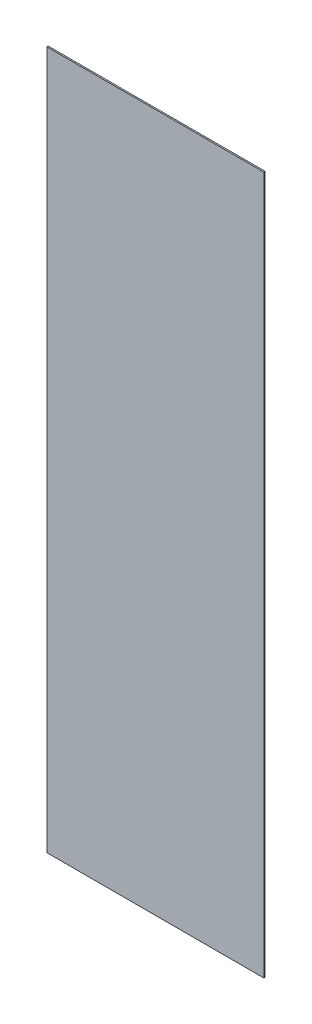
ISO-10303-21;
HEADER;
FILE_DESCRIPTION(('STEP AP214'),'2;1');
FILE_NAME('part.step','',(''),(''),'','','');
FILE_SCHEMA(('AUTOMOTIVE_DESIGN { 1 0 10303 214 1 1 1 1 }'));
ENDSEC;
DATA;
#1=APPLICATION_CONTEXT('core data for automotive mechanical design processes');
#2=APPLICATION_PROTOCOL_DEFINITION('international standard','automotive_design',2000,#1);
#3=PRODUCT_CONTEXT('',#1,'mechanical');
#4=PRODUCT('Part','Part','',(#3));
#5=PRODUCT_RELATED_PRODUCT_CATEGORY('part','',(#4));
#6=PRODUCT_DEFINITION_FORMATION('','',#4);
#7=PRODUCT_DEFINITION_CONTEXT('part definition',#1,'design');
#8=PRODUCT_DEFINITION('design','',#6,#7);
#9=PRODUCT_DEFINITION_SHAPE('','',#8);
#10=(LENGTH_UNIT() NAMED_UNIT(*) SI_UNIT(.MILLI.,.METRE.));
#11=(NAMED_UNIT(*) PLANE_ANGLE_UNIT() SI_UNIT($,.RADIAN.));
#12=(NAMED_UNIT(*) SI_UNIT($,.STERADIAN.) SOLID_ANGLE_UNIT());
#13=UNCERTAINTY_MEASURE_WITH_UNIT(LENGTH_MEASURE(1.E-05),#10,'distance_accuracy_value','');
#14=(GEOMETRIC_REPRESENTATION_CONTEXT(3) GLOBAL_UNCERTAINTY_ASSIGNED_CONTEXT((#13)) GLOBAL_UNIT_ASSIGNED_CONTEXT((#10,
#11,#12)) REPRESENTATION_CONTEXT('',''));
#15=CARTESIAN_POINT('',(0.,0.,0.));
#16=DIRECTION('',(0.,0.,1.));
#17=DIRECTION('',(1.,0.,0.));
#18=AXIS2_PLACEMENT_3D('',#15,#16,#17);
#19=CARTESIAN_POINT('',(-1580.,5080.,20.));
#20=DIRECTION('',(1.,0.,0.));
#21=DIRECTION('',(0.,1.,0.));
#22=AXIS2_PLACEMENT_3D('',#19,#20,#21);
#23=PLANE('',#22);
#24=DIRECTION('',(0.,-1.,0.));
#25=VECTOR('',#24,1.);
#26=CARTESIAN_POINT('',(-1580.,5080.,0.));
#27=LINE('',#26,#25);
#28=CARTESIAN_POINT('',(-1580.,5080.,0.));
#29=VERTEX_POINT('',#28);
#30=CARTESIAN_POINT('',(-1580.,-5080.,0.));
#31=VERTEX_POINT('',#30);
#32=EDGE_CURVE('E100',#29,#31,#27,.T.);
#33=ORIENTED_EDGE('',*,*,#32,.T.);
#34=DIRECTION('',(0.,0.,-1.));
#35=VECTOR('',#34,1.);
#36=CARTESIAN_POINT('',(-1580.,-5080.,20.));
#37=LINE('',#36,#35);
#38=CARTESIAN_POINT('',(-1580.,-5080.,20.));
#39=VERTEX_POINT('',#38);
#40=EDGE_CURVE('E11',#39,#31,#37,.T.);
#41=ORIENTED_EDGE('',*,*,#40,.F.);
#42=DIRECTION('',(0.,-1.,0.));
#43=VECTOR('',#42,1.);
#44=CARTESIAN_POINT('',(-1580.,5080.,20.));
#45=LINE('',#44,#43);
#46=CARTESIAN_POINT('',(-1580.,5080.,20.));
#47=VERTEX_POINT('',#46);
#48=EDGE_CURVE('E88',#47,#39,#45,.T.);
#49=ORIENTED_EDGE('',*,*,#48,.F.);
#50=DIRECTION('',(0.,0.,-1.));
#51=VECTOR('',#50,1.);
#52=CARTESIAN_POINT('',(-1580.,5080.,20.));
#53=LINE('',#52,#51);
#54=EDGE_CURVE('E96',#47,#29,#53,.T.);
#55=ORIENTED_EDGE('',*,*,#54,.T.);
#56=EDGE_LOOP('',(#33,#41,#49,#55));
#57=FACE_BOUND('',#56,.T.);
#58=ADVANCED_FACE('F37',(#57),#23,.F.);
#59=CARTESIAN_POINT('',(1580.,-5080.,20.));
#60=DIRECTION('',(0.,1.,0.));
#61=DIRECTION('',(0.,0.,1.));
#62=AXIS2_PLACEMENT_3D('',#59,#60,#61);
#63=PLANE('',#62);
#64=DIRECTION('',(1.,0.,0.));
#65=VECTOR('',#64,1.);
#66=CARTESIAN_POINT('',(1580.,-5080.,0.));
#67=LINE('',#66,#65);
#68=CARTESIAN_POINT('',(1580.,-5080.,0.));
#69=VERTEX_POINT('',#68);
#70=EDGE_CURVE('E92',#31,#69,#67,.T.);
#71=ORIENTED_EDGE('',*,*,#70,.T.);
#72=DIRECTION('',(0.,0.,-1.));
#73=VECTOR('',#72,1.);
#74=CARTESIAN_POINT('',(1580.,-5080.,20.));
#75=LINE('',#74,#73);
#76=CARTESIAN_POINT('',(1580.,-5080.,20.));
#77=VERTEX_POINT('',#76);
#78=EDGE_CURVE('E45',#77,#69,#75,.T.);
#79=ORIENTED_EDGE('',*,*,#78,.F.);
#80=DIRECTION('',(1.,0.,0.));
#81=VECTOR('',#80,1.);
#82=CARTESIAN_POINT('',(1580.,-5080.,20.));
#83=LINE('',#82,#81);
#84=EDGE_CURVE('E83',#39,#77,#83,.T.);
#85=ORIENTED_EDGE('',*,*,#84,.F.);
#86=ORIENTED_EDGE('',*,*,#40,.T.);
#87=EDGE_LOOP('',(#71,#79,#85,#86));
#88=FACE_BOUND('',#87,.T.);
#89=ADVANCED_FACE('F91',(#88),#63,.F.);
#90=CARTESIAN_POINT('',(1580.,5080.,20.));
#91=DIRECTION('',(-1.,0.,0.));
#92=DIRECTION('',(0.,-1.,0.));
#93=AXIS2_PLACEMENT_3D('',#90,#91,#92);
#94=PLANE('',#93);
#95=DIRECTION('',(0.,1.,0.));
#96=VECTOR('',#95,1.);
#97=CARTESIAN_POINT('',(1580.,5080.,0.));
#98=LINE('',#97,#96);
#99=CARTESIAN_POINT('',(1580.,5080.,0.));
#100=VERTEX_POINT('',#99);
#101=EDGE_CURVE('E70',#69,#100,#98,.T.);
#102=ORIENTED_EDGE('',*,*,#101,.T.);
#103=DIRECTION('',(0.,0.,-1.));
#104=VECTOR('',#103,1.);
#105=CARTESIAN_POINT('',(1580.,5080.,20.));
#106=LINE('',#105,#104);
#107=CARTESIAN_POINT('',(1580.,5080.,20.));
#108=VERTEX_POINT('',#107);
#109=EDGE_CURVE('E93',#108,#100,#106,.T.);
#110=ORIENTED_EDGE('',*,*,#109,.F.);
#111=DIRECTION('',(0.,1.,0.));
#112=VECTOR('',#111,1.);
#113=CARTESIAN_POINT('',(1580.,5080.,20.));
#114=LINE('',#113,#112);
#115=EDGE_CURVE('E86',#77,#108,#114,.T.);
#116=ORIENTED_EDGE('',*,*,#115,.F.);
#117=ORIENTED_EDGE('',*,*,#78,.T.);
#118=EDGE_LOOP('',(#102,#110,#116,#117));
#119=FACE_BOUND('',#118,.T.);
#120=ADVANCED_FACE('F94',(#119),#94,.F.);
#121=CARTESIAN_POINT('',(1580.,5080.,20.));
#122=DIRECTION('',(0.,-1.,0.));
#123=DIRECTION('',(0.,0.,-1.));
#124=AXIS2_PLACEMENT_3D('',#121,#122,#123);
#125=PLANE('',#124);
#126=DIRECTION('',(-1.,0.,0.));
#127=VECTOR('',#126,1.);
#128=CARTESIAN_POINT('',(1580.,5080.,0.));
#129=LINE('',#128,#127);
#130=EDGE_CURVE('E76',#100,#29,#129,.T.);
#131=ORIENTED_EDGE('',*,*,#130,.T.);
#132=ORIENTED_EDGE('',*,*,#54,.F.);
#133=DIRECTION('',(-1.,0.,0.));
#134=VECTOR('',#133,1.);
#135=CARTESIAN_POINT('',(1580.,5080.,20.));
#136=LINE('',#135,#134);
#137=EDGE_CURVE('E53',#108,#47,#136,.T.);
#138=ORIENTED_EDGE('',*,*,#137,.F.);
#139=ORIENTED_EDGE('',*,*,#109,.T.);
#140=EDGE_LOOP('',(#131,#132,#138,#139));
#141=FACE_BOUND('',#140,.T.);
#142=ADVANCED_FACE('F107',(#141),#125,.F.);
#143=CARTESIAN_POINT('',(0.,0.,20.));
#144=DIRECTION('',(0.,0.,-1.));
#145=DIRECTION('',(-1.,0.,0.));
#146=AXIS2_PLACEMENT_3D('',#143,#144,#145);
#147=PLANE('',#146);
#148=ORIENTED_EDGE('',*,*,#48,.T.);
#149=ORIENTED_EDGE('',*,*,#84,.T.);
#150=ORIENTED_EDGE('',*,*,#115,.T.);
#151=ORIENTED_EDGE('',*,*,#137,.T.);
#152=EDGE_LOOP('',(#148,#149,#150,#151));
#153=FACE_BOUND('',#152,.T.);
#154=ADVANCED_FACE('F84',(#153),#147,.F.);
#155=CARTESIAN_POINT('',(0.,0.,0.));
#156=DIRECTION('',(0.,0.,-1.));
#157=DIRECTION('',(-1.,0.,0.));
#158=AXIS2_PLACEMENT_3D('',#155,#156,#157);
#159=PLANE('',#158);
#160=ORIENTED_EDGE('',*,*,#32,.F.);
#161=ORIENTED_EDGE('',*,*,#130,.F.);
#162=ORIENTED_EDGE('',*,*,#101,.F.);
#163=ORIENTED_EDGE('',*,*,#70,.F.);
#164=EDGE_LOOP('',(#160,#161,#162,#163));
#165=FACE_BOUND('',#164,.T.);
#166=ADVANCED_FACE('F110',(#165),#159,.T.);
#167=CLOSED_SHELL('',(#58,#89,#120,#142,#154,#166));
#168=MANIFOLD_SOLID_BREP('B2',#167);
#169=ADVANCED_BREP_SHAPE_REPRESENTATION('',(#18,#168),#14);
#170=SHAPE_DEFINITION_REPRESENTATION(#9,#169);
ENDSEC;
END-ISO-10303-21;
